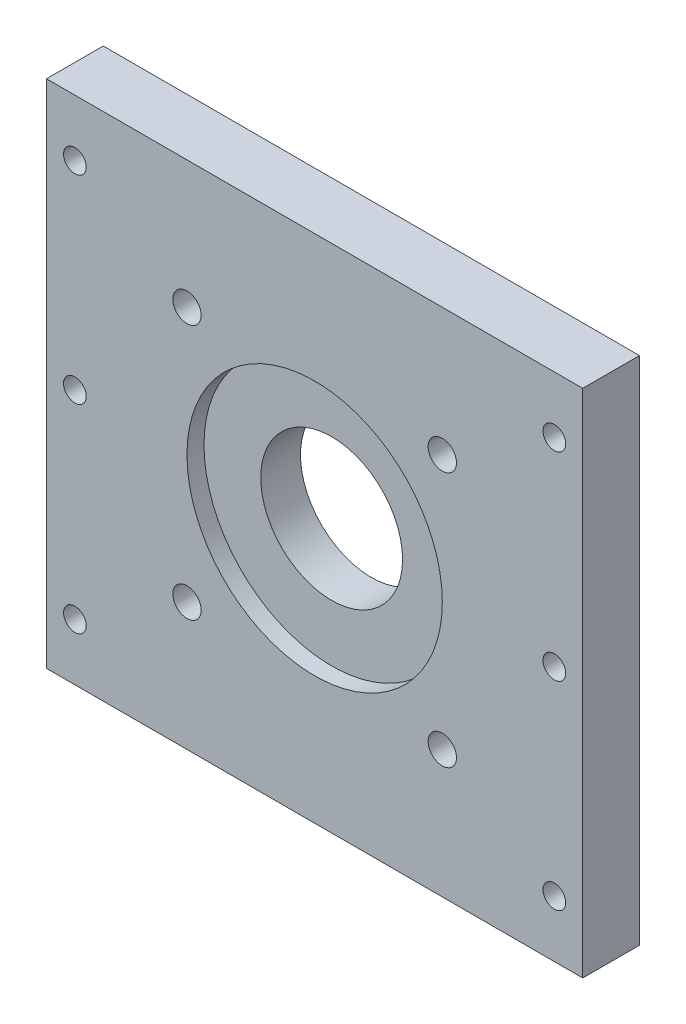
ISO-10303-21;
HEADER;
FILE_DESCRIPTION(('STEP AP214'),'2;1');
FILE_NAME('part.step','',(''),(''),'','','');
FILE_SCHEMA(('AUTOMOTIVE_DESIGN { 1 0 10303 214 1 1 1 1 }'));
ENDSEC;
DATA;
#1=APPLICATION_CONTEXT('core data for automotive mechanical design processes');
#2=APPLICATION_PROTOCOL_DEFINITION('international standard','automotive_design',2000,#1);
#3=PRODUCT_CONTEXT('',#1,'mechanical');
#4=PRODUCT('Part','Part','',(#3));
#5=PRODUCT_RELATED_PRODUCT_CATEGORY('part','',(#4));
#6=PRODUCT_DEFINITION_FORMATION('','',#4);
#7=PRODUCT_DEFINITION_CONTEXT('part definition',#1,'design');
#8=PRODUCT_DEFINITION('design','',#6,#7);
#9=PRODUCT_DEFINITION_SHAPE('','',#8);
#10=(LENGTH_UNIT() NAMED_UNIT(*) SI_UNIT(.MILLI.,.METRE.));
#11=(NAMED_UNIT(*) PLANE_ANGLE_UNIT() SI_UNIT($,.RADIAN.));
#12=(NAMED_UNIT(*) SI_UNIT($,.STERADIAN.) SOLID_ANGLE_UNIT());
#13=UNCERTAINTY_MEASURE_WITH_UNIT(LENGTH_MEASURE(1.E-05),#10,'distance_accuracy_value','');
#14=(GEOMETRIC_REPRESENTATION_CONTEXT(3) GLOBAL_UNCERTAINTY_ASSIGNED_CONTEXT((#13)) GLOBAL_UNIT_ASSIGNED_CONTEXT((#10,
#11,#12)) REPRESENTATION_CONTEXT('',''));
#15=CARTESIAN_POINT('',(0.,0.,0.));
#16=DIRECTION('',(0.,0.,1.));
#17=DIRECTION('',(1.,0.,0.));
#18=AXIS2_PLACEMENT_3D('',#15,#16,#17);
#19=CARTESIAN_POINT('',(47.25,45.,10.));
#20=DIRECTION('',(0.,0.,-1.));
#21=DIRECTION('',(-1.,0.,0.));
#22=AXIS2_PLACEMENT_3D('',#19,#20,#21);
#23=CYLINDRICAL_SURFACE('',#22,12.5);
#24=CARTESIAN_POINT('',(47.25,45.,0.));
#25=DIRECTION('',(0.,0.,1.));
#26=DIRECTION('',(1.,0.,0.));
#27=AXIS2_PLACEMENT_3D('',#24,#25,#26);
#28=CIRCLE('',#27,12.5);
#29=CARTESIAN_POINT('',(59.75,45.,0.));
#30=VERTEX_POINT('',#29);
#31=EDGE_CURVE('E176',#30,#30,#28,.T.);
#32=ORIENTED_EDGE('',*,*,#31,.F.);
#33=EDGE_LOOP('',(#32));
#34=FACE_BOUND('',#33,.T.);
#35=CARTESIAN_POINT('',(47.25,45.,7.));
#36=DIRECTION('',(0.,0.,1.));
#37=DIRECTION('',(1.,0.,0.));
#38=AXIS2_PLACEMENT_3D('',#35,#36,#37);
#39=CIRCLE('',#38,12.5);
#40=CARTESIAN_POINT('',(59.75,45.,7.));
#41=VERTEX_POINT('',#40);
#42=EDGE_CURVE('E41',#41,#41,#39,.T.);
#43=ORIENTED_EDGE('',*,*,#42,.T.);
#44=EDGE_LOOP('',(#43));
#45=FACE_BOUND('',#44,.T.);
#46=ADVANCED_FACE('F37',(#34,#45),#23,.F.);
#47=CARTESIAN_POINT('',(0.,0.,10.));
#48=DIRECTION('',(0.,0.,-1.));
#49=DIRECTION('',(-1.,0.,0.));
#50=AXIS2_PLACEMENT_3D('',#47,#48,#49);
#51=PLANE('',#50);
#52=CARTESIAN_POINT('',(47.25,45.,10.));
#53=DIRECTION('',(0.,0.,1.));
#54=DIRECTION('',(1.,0.,0.));
#55=AXIS2_PLACEMENT_3D('',#52,#53,#54);
#56=CIRCLE('',#55,22.5);
#57=CARTESIAN_POINT('',(69.75,45.,10.));
#58=VERTEX_POINT('',#57);
#59=EDGE_CURVE('E181',#58,#58,#56,.T.);
#60=ORIENTED_EDGE('',*,*,#59,.F.);
#61=EDGE_LOOP('',(#60));
#62=FACE_BOUND('',#61,.T.);
#63=DIRECTION('',(0.,-1.,0.));
#64=VECTOR('',#63,1.);
#65=CARTESIAN_POINT('',(0.,0.,10.));
#66=LINE('',#65,#64);
#67=CARTESIAN_POINT('',(0.,90.,10.));
#68=VERTEX_POINT('',#67);
#69=CARTESIAN_POINT('',(0.,0.,10.));
#70=VERTEX_POINT('',#69);
#71=EDGE_CURVE('E91',#68,#70,#66,.T.);
#72=ORIENTED_EDGE('',*,*,#71,.T.);
#73=DIRECTION('',(1.,0.,0.));
#74=VECTOR('',#73,1.);
#75=CARTESIAN_POINT('',(0.,0.,10.));
#76=LINE('',#75,#74);
#77=CARTESIAN_POINT('',(94.5,0.,10.));
#78=VERTEX_POINT('',#77);
#79=EDGE_CURVE('E85',#70,#78,#76,.T.);
#80=ORIENTED_EDGE('',*,*,#79,.T.);
#81=DIRECTION('',(0.,1.,0.));
#82=VECTOR('',#81,1.);
#83=CARTESIAN_POINT('',(94.5,0.,10.));
#84=LINE('',#83,#82);
#85=CARTESIAN_POINT('',(94.5,90.,10.));
#86=VERTEX_POINT('',#85);
#87=EDGE_CURVE('E89',#78,#86,#84,.T.);
#88=ORIENTED_EDGE('',*,*,#87,.T.);
#89=DIRECTION('',(-1.,0.,0.));
#90=VECTOR('',#89,1.);
#91=CARTESIAN_POINT('',(0.,90.,10.));
#92=LINE('',#91,#90);
#93=EDGE_CURVE('E55',#86,#68,#92,.T.);
#94=ORIENTED_EDGE('',*,*,#93,.T.);
#95=EDGE_LOOP('',(#72,#80,#88,#94));
#96=FACE_BOUND('',#95,.T.);
#97=CARTESIAN_POINT('',(5.00000000000001,80.,10.));
#98=DIRECTION('',(0.,0.,1.));
#99=DIRECTION('',(1.,0.,0.));
#100=AXIS2_PLACEMENT_3D('',#97,#98,#99);
#101=CIRCLE('',#100,2.);
#102=CARTESIAN_POINT('',(7.00000000000001,80.,10.));
#103=VERTEX_POINT('',#102);
#104=EDGE_CURVE('E107',#103,#103,#101,.T.);
#105=ORIENTED_EDGE('',*,*,#104,.F.);
#106=EDGE_LOOP('',(#105));
#107=FACE_BOUND('',#106,.T.);
#108=CARTESIAN_POINT('',(5.00000000000001,45.,10.));
#109=DIRECTION('',(0.,0.,1.));
#110=DIRECTION('',(1.,0.,0.));
#111=AXIS2_PLACEMENT_3D('',#108,#109,#110);
#112=CIRCLE('',#111,2.);
#113=CARTESIAN_POINT('',(7.00000000000001,45.,10.));
#114=VERTEX_POINT('',#113);
#115=EDGE_CURVE('E122',#114,#114,#112,.T.);
#116=ORIENTED_EDGE('',*,*,#115,.F.);
#117=EDGE_LOOP('',(#116));
#118=FACE_BOUND('',#117,.T.);
#119=CARTESIAN_POINT('',(5.00000000000001,10.,10.));
#120=DIRECTION('',(0.,0.,1.));
#121=DIRECTION('',(-1.,0.,0.));
#122=AXIS2_PLACEMENT_3D('',#119,#120,#121);
#123=CIRCLE('',#122,2.);
#124=CARTESIAN_POINT('',(3.00000000000001,10.,10.));
#125=VERTEX_POINT('',#124);
#126=EDGE_CURVE('E128',#125,#125,#123,.T.);
#127=ORIENTED_EDGE('',*,*,#126,.F.);
#128=EDGE_LOOP('',(#127));
#129=FACE_BOUND('',#128,.T.);
#130=CARTESIAN_POINT('',(89.5,10.,10.));
#131=DIRECTION('',(0.,0.,1.));
#132=DIRECTION('',(1.,0.,0.));
#133=AXIS2_PLACEMENT_3D('',#130,#131,#132);
#134=CIRCLE('',#133,2.);
#135=CARTESIAN_POINT('',(91.5,10.,10.));
#136=VERTEX_POINT('',#135);
#137=EDGE_CURVE('E134',#136,#136,#134,.T.);
#138=ORIENTED_EDGE('',*,*,#137,.F.);
#139=EDGE_LOOP('',(#138));
#140=FACE_BOUND('',#139,.T.);
#141=CARTESIAN_POINT('',(89.5,45.,10.));
#142=DIRECTION('',(0.,0.,1.));
#143=DIRECTION('',(-1.,0.,0.));
#144=AXIS2_PLACEMENT_3D('',#141,#142,#143);
#145=CIRCLE('',#144,2.00000000000001);
#146=CARTESIAN_POINT('',(87.5,45.,10.));
#147=VERTEX_POINT('',#146);
#148=EDGE_CURVE('E140',#147,#147,#145,.T.);
#149=ORIENTED_EDGE('',*,*,#148,.F.);
#150=EDGE_LOOP('',(#149));
#151=FACE_BOUND('',#150,.T.);
#152=CARTESIAN_POINT('',(89.5,80.,10.));
#153=DIRECTION('',(0.,0.,1.));
#154=DIRECTION('',(-1.,0.,0.));
#155=AXIS2_PLACEMENT_3D('',#152,#153,#154);
#156=CIRCLE('',#155,2.);
#157=CARTESIAN_POINT('',(87.5,80.,10.));
#158=VERTEX_POINT('',#157);
#159=EDGE_CURVE('E146',#158,#158,#156,.T.);
#160=ORIENTED_EDGE('',*,*,#159,.F.);
#161=EDGE_LOOP('',(#160));
#162=FACE_BOUND('',#161,.T.);
#163=CARTESIAN_POINT('',(24.75,67.5,10.));
#164=DIRECTION('',(0.,0.,1.));
#165=DIRECTION('',(1.,0.,0.));
#166=AXIS2_PLACEMENT_3D('',#163,#164,#165);
#167=CIRCLE('',#166,2.5);
#168=CARTESIAN_POINT('',(27.25,67.5,10.));
#169=VERTEX_POINT('',#168);
#170=EDGE_CURVE('E152',#169,#169,#167,.T.);
#171=ORIENTED_EDGE('',*,*,#170,.F.);
#172=EDGE_LOOP('',(#171));
#173=FACE_BOUND('',#172,.T.);
#174=CARTESIAN_POINT('',(69.75,67.5,10.));
#175=DIRECTION('',(0.,0.,1.));
#176=DIRECTION('',(1.,0.,0.));
#177=AXIS2_PLACEMENT_3D('',#174,#175,#176);
#178=CIRCLE('',#177,2.50000000000001);
#179=CARTESIAN_POINT('',(72.25,67.5,10.));
#180=VERTEX_POINT('',#179);
#181=EDGE_CURVE('E158',#180,#180,#178,.T.);
#182=ORIENTED_EDGE('',*,*,#181,.F.);
#183=EDGE_LOOP('',(#182));
#184=FACE_BOUND('',#183,.T.);
#185=CARTESIAN_POINT('',(69.75,22.5,10.));
#186=DIRECTION('',(0.,0.,1.));
#187=DIRECTION('',(1.,0.,0.));
#188=AXIS2_PLACEMENT_3D('',#185,#186,#187);
#189=CIRCLE('',#188,2.50000000000001);
#190=CARTESIAN_POINT('',(72.25,22.5,10.));
#191=VERTEX_POINT('',#190);
#192=EDGE_CURVE('E164',#191,#191,#189,.T.);
#193=ORIENTED_EDGE('',*,*,#192,.F.);
#194=EDGE_LOOP('',(#193));
#195=FACE_BOUND('',#194,.T.);
#196=CARTESIAN_POINT('',(24.75,22.5,10.));
#197=DIRECTION('',(0.,0.,1.));
#198=DIRECTION('',(1.,0.,0.));
#199=AXIS2_PLACEMENT_3D('',#196,#197,#198);
#200=CIRCLE('',#199,2.5);
#201=CARTESIAN_POINT('',(27.25,22.5,10.));
#202=VERTEX_POINT('',#201);
#203=EDGE_CURVE('E170',#202,#202,#200,.T.);
#204=ORIENTED_EDGE('',*,*,#203,.F.);
#205=EDGE_LOOP('',(#204));
#206=FACE_BOUND('',#205,.T.);
#207=ADVANCED_FACE('F86',(#62,#96,#107,#118,#129,#140,#151,#162,#173,#184,#195,#206),#51,.F.);
#208=CARTESIAN_POINT('',(0.,0.,0.));
#209=DIRECTION('',(0.,0.,-1.));
#210=DIRECTION('',(-1.,0.,0.));
#211=AXIS2_PLACEMENT_3D('',#208,#209,#210);
#212=PLANE('',#211);
#213=CARTESIAN_POINT('',(24.75,22.5,0.));
#214=DIRECTION('',(0.,0.,1.));
#215=DIRECTION('',(1.,0.,0.));
#216=AXIS2_PLACEMENT_3D('',#213,#214,#215);
#217=CIRCLE('',#216,2.5);
#218=CARTESIAN_POINT('',(27.25,22.5,0.));
#219=VERTEX_POINT('',#218);
#220=EDGE_CURVE('E173',#219,#219,#217,.T.);
#221=ORIENTED_EDGE('',*,*,#220,.T.);
#222=EDGE_LOOP('',(#221));
#223=FACE_BOUND('',#222,.T.);
#224=CARTESIAN_POINT('',(69.75,67.5,0.));
#225=DIRECTION('',(0.,0.,1.));
#226=DIRECTION('',(1.,0.,0.));
#227=AXIS2_PLACEMENT_3D('',#224,#225,#226);
#228=CIRCLE('',#227,2.50000000000001);
#229=CARTESIAN_POINT('',(72.25,67.5,0.));
#230=VERTEX_POINT('',#229);
#231=EDGE_CURVE('E161',#230,#230,#228,.T.);
#232=ORIENTED_EDGE('',*,*,#231,.T.);
#233=EDGE_LOOP('',(#232));
#234=FACE_BOUND('',#233,.T.);
#235=CARTESIAN_POINT('',(89.5,80.,0.));
#236=DIRECTION('',(0.,0.,1.));
#237=DIRECTION('',(-1.,0.,0.));
#238=AXIS2_PLACEMENT_3D('',#235,#236,#237);
#239=CIRCLE('',#238,2.);
#240=CARTESIAN_POINT('',(87.5,80.,0.));
#241=VERTEX_POINT('',#240);
#242=EDGE_CURVE('E149',#241,#241,#239,.T.);
#243=ORIENTED_EDGE('',*,*,#242,.T.);
#244=EDGE_LOOP('',(#243));
#245=FACE_BOUND('',#244,.T.);
#246=CARTESIAN_POINT('',(89.5,10.,0.));
#247=DIRECTION('',(0.,0.,1.));
#248=DIRECTION('',(1.,0.,0.));
#249=AXIS2_PLACEMENT_3D('',#246,#247,#248);
#250=CIRCLE('',#249,2.);
#251=CARTESIAN_POINT('',(91.5,10.,0.));
#252=VERTEX_POINT('',#251);
#253=EDGE_CURVE('E137',#252,#252,#250,.T.);
#254=ORIENTED_EDGE('',*,*,#253,.T.);
#255=EDGE_LOOP('',(#254));
#256=FACE_BOUND('',#255,.T.);
#257=CARTESIAN_POINT('',(5.00000000000001,45.,0.));
#258=DIRECTION('',(0.,0.,1.));
#259=DIRECTION('',(1.,0.,0.));
#260=AXIS2_PLACEMENT_3D('',#257,#258,#259);
#261=CIRCLE('',#260,2.);
#262=CARTESIAN_POINT('',(7.00000000000001,45.,0.));
#263=VERTEX_POINT('',#262);
#264=EDGE_CURVE('E125',#263,#263,#261,.T.);
#265=ORIENTED_EDGE('',*,*,#264,.T.);
#266=EDGE_LOOP('',(#265));
#267=FACE_BOUND('',#266,.T.);
#268=DIRECTION('',(0.,-1.,0.));
#269=VECTOR('',#268,1.);
#270=CARTESIAN_POINT('',(0.,0.,0.));
#271=LINE('',#270,#269);
#272=CARTESIAN_POINT('',(0.,90.,0.));
#273=VERTEX_POINT('',#272);
#274=CARTESIAN_POINT('',(0.,0.,0.));
#275=VERTEX_POINT('',#274);
#276=EDGE_CURVE('E104',#273,#275,#271,.T.);
#277=ORIENTED_EDGE('',*,*,#276,.F.);
#278=DIRECTION('',(-1.,0.,0.));
#279=VECTOR('',#278,1.);
#280=CARTESIAN_POINT('',(0.,90.,0.));
#281=LINE('',#280,#279);
#282=CARTESIAN_POINT('',(94.5,90.,0.));
#283=VERTEX_POINT('',#282);
#284=EDGE_CURVE('E78',#283,#273,#281,.T.);
#285=ORIENTED_EDGE('',*,*,#284,.F.);
#286=DIRECTION('',(0.,1.,0.));
#287=VECTOR('',#286,1.);
#288=CARTESIAN_POINT('',(94.5,0.,0.));
#289=LINE('',#288,#287);
#290=CARTESIAN_POINT('',(94.5,0.,0.));
#291=VERTEX_POINT('',#290);
#292=EDGE_CURVE('E72',#291,#283,#289,.T.);
#293=ORIENTED_EDGE('',*,*,#292,.F.);
#294=DIRECTION('',(1.,0.,0.));
#295=VECTOR('',#294,1.);
#296=CARTESIAN_POINT('',(0.,0.,0.));
#297=LINE('',#296,#295);
#298=EDGE_CURVE('E95',#275,#291,#297,.T.);
#299=ORIENTED_EDGE('',*,*,#298,.F.);
#300=EDGE_LOOP('',(#277,#285,#293,#299));
#301=FACE_BOUND('',#300,.T.);
#302=CARTESIAN_POINT('',(5.00000000000001,80.,0.));
#303=DIRECTION('',(0.,0.,1.));
#304=DIRECTION('',(1.,0.,0.));
#305=AXIS2_PLACEMENT_3D('',#302,#303,#304);
#306=CIRCLE('',#305,2.);
#307=CARTESIAN_POINT('',(7.00000000000001,80.,0.));
#308=VERTEX_POINT('',#307);
#309=EDGE_CURVE('E119',#308,#308,#306,.T.);
#310=ORIENTED_EDGE('',*,*,#309,.T.);
#311=EDGE_LOOP('',(#310));
#312=FACE_BOUND('',#311,.T.);
#313=CARTESIAN_POINT('',(5.00000000000001,10.,0.));
#314=DIRECTION('',(0.,0.,1.));
#315=DIRECTION('',(-1.,0.,0.));
#316=AXIS2_PLACEMENT_3D('',#313,#314,#315);
#317=CIRCLE('',#316,2.);
#318=CARTESIAN_POINT('',(3.00000000000001,10.,0.));
#319=VERTEX_POINT('',#318);
#320=EDGE_CURVE('E131',#319,#319,#317,.T.);
#321=ORIENTED_EDGE('',*,*,#320,.T.);
#322=EDGE_LOOP('',(#321));
#323=FACE_BOUND('',#322,.T.);
#324=CARTESIAN_POINT('',(89.5,45.,0.));
#325=DIRECTION('',(0.,0.,1.));
#326=DIRECTION('',(-1.,0.,0.));
#327=AXIS2_PLACEMENT_3D('',#324,#325,#326);
#328=CIRCLE('',#327,2.00000000000001);
#329=CARTESIAN_POINT('',(87.5,45.,0.));
#330=VERTEX_POINT('',#329);
#331=EDGE_CURVE('E143',#330,#330,#328,.T.);
#332=ORIENTED_EDGE('',*,*,#331,.T.);
#333=EDGE_LOOP('',(#332));
#334=FACE_BOUND('',#333,.T.);
#335=CARTESIAN_POINT('',(24.75,67.5,0.));
#336=DIRECTION('',(0.,0.,1.));
#337=DIRECTION('',(1.,0.,0.));
#338=AXIS2_PLACEMENT_3D('',#335,#336,#337);
#339=CIRCLE('',#338,2.5);
#340=CARTESIAN_POINT('',(27.25,67.5,0.));
#341=VERTEX_POINT('',#340);
#342=EDGE_CURVE('E155',#341,#341,#339,.T.);
#343=ORIENTED_EDGE('',*,*,#342,.T.);
#344=EDGE_LOOP('',(#343));
#345=FACE_BOUND('',#344,.T.);
#346=CARTESIAN_POINT('',(69.75,22.5,0.));
#347=DIRECTION('',(0.,0.,1.));
#348=DIRECTION('',(1.,0.,0.));
#349=AXIS2_PLACEMENT_3D('',#346,#347,#348);
#350=CIRCLE('',#349,2.50000000000001);
#351=CARTESIAN_POINT('',(72.25,22.5,0.));
#352=VERTEX_POINT('',#351);
#353=EDGE_CURVE('E167',#352,#352,#350,.T.);
#354=ORIENTED_EDGE('',*,*,#353,.T.);
#355=EDGE_LOOP('',(#354));
#356=FACE_BOUND('',#355,.T.);
#357=ORIENTED_EDGE('',*,*,#31,.T.);
#358=EDGE_LOOP('',(#357));
#359=FACE_BOUND('',#358,.T.);
#360=ADVANCED_FACE('F115',(#223,#234,#245,#256,#267,#301,#312,#323,#334,#345,#356,#359),#212,.T.);
#361=CARTESIAN_POINT('',(0.,0.,10.));
#362=DIRECTION('',(1.,0.,0.));
#363=DIRECTION('',(0.,0.,-1.));
#364=AXIS2_PLACEMENT_3D('',#361,#362,#363);
#365=PLANE('',#364);
#366=ORIENTED_EDGE('',*,*,#276,.T.);
#367=DIRECTION('',(0.,0.,-1.));
#368=VECTOR('',#367,1.);
#369=CARTESIAN_POINT('',(0.,0.,10.));
#370=LINE('',#369,#368);
#371=EDGE_CURVE('E11',#70,#275,#370,.T.);
#372=ORIENTED_EDGE('',*,*,#371,.F.);
#373=ORIENTED_EDGE('',*,*,#71,.F.);
#374=DIRECTION('',(0.,0.,-1.));
#375=VECTOR('',#374,1.);
#376=CARTESIAN_POINT('',(0.,90.,10.));
#377=LINE('',#376,#375);
#378=EDGE_CURVE('E100',#68,#273,#377,.T.);
#379=ORIENTED_EDGE('',*,*,#378,.T.);
#380=EDGE_LOOP('',(#366,#372,#373,#379));
#381=FACE_BOUND('',#380,.T.);
#382=ADVANCED_FACE('F39',(#381),#365,.F.);
#383=CARTESIAN_POINT('',(0.,0.,10.));
#384=DIRECTION('',(0.,1.,0.));
#385=DIRECTION('',(0.,0.,1.));
#386=AXIS2_PLACEMENT_3D('',#383,#384,#385);
#387=PLANE('',#386);
#388=ORIENTED_EDGE('',*,*,#298,.T.);
#389=DIRECTION('',(0.,0.,-1.));
#390=VECTOR('',#389,1.);
#391=CARTESIAN_POINT('',(94.5,0.,10.));
#392=LINE('',#391,#390);
#393=EDGE_CURVE('E47',#78,#291,#392,.T.);
#394=ORIENTED_EDGE('',*,*,#393,.F.);
#395=ORIENTED_EDGE('',*,*,#79,.F.);
#396=ORIENTED_EDGE('',*,*,#371,.T.);
#397=EDGE_LOOP('',(#388,#394,#395,#396));
#398=FACE_BOUND('',#397,.T.);
#399=ADVANCED_FACE('F94',(#398),#387,.F.);
#400=CARTESIAN_POINT('',(94.5,0.,10.));
#401=DIRECTION('',(-1.,0.,0.));
#402=DIRECTION('',(0.,0.,1.));
#403=AXIS2_PLACEMENT_3D('',#400,#401,#402);
#404=PLANE('',#403);
#405=ORIENTED_EDGE('',*,*,#292,.T.);
#406=DIRECTION('',(0.,0.,-1.));
#407=VECTOR('',#406,1.);
#408=CARTESIAN_POINT('',(94.5,90.,10.));
#409=LINE('',#408,#407);
#410=EDGE_CURVE('E96',#86,#283,#409,.T.);
#411=ORIENTED_EDGE('',*,*,#410,.F.);
#412=ORIENTED_EDGE('',*,*,#87,.F.);
#413=ORIENTED_EDGE('',*,*,#393,.T.);
#414=EDGE_LOOP('',(#405,#411,#412,#413));
#415=FACE_BOUND('',#414,.T.);
#416=ADVANCED_FACE('F98',(#415),#404,.F.);
#417=CARTESIAN_POINT('',(0.,90.,10.));
#418=DIRECTION('',(0.,-1.,0.));
#419=DIRECTION('',(1.,0.,0.));
#420=AXIS2_PLACEMENT_3D('',#417,#418,#419);
#421=PLANE('',#420);
#422=ORIENTED_EDGE('',*,*,#284,.T.);
#423=ORIENTED_EDGE('',*,*,#378,.F.);
#424=ORIENTED_EDGE('',*,*,#93,.F.);
#425=ORIENTED_EDGE('',*,*,#410,.T.);
#426=EDGE_LOOP('',(#422,#423,#424,#425));
#427=FACE_BOUND('',#426,.T.);
#428=ADVANCED_FACE('F112',(#427),#421,.F.);
#429=CARTESIAN_POINT('',(5.00000000000001,80.,10.));
#430=DIRECTION('',(0.,0.,-1.));
#431=DIRECTION('',(-1.,0.,0.));
#432=AXIS2_PLACEMENT_3D('',#429,#430,#431);
#433=CYLINDRICAL_SURFACE('',#432,2.);
#434=ORIENTED_EDGE('',*,*,#104,.T.);
#435=EDGE_LOOP('',(#434));
#436=FACE_BOUND('',#435,.T.);
#437=ORIENTED_EDGE('',*,*,#309,.F.);
#438=EDGE_LOOP('',(#437));
#439=FACE_BOUND('',#438,.T.);
#440=ADVANCED_FACE('F247',(#436,#439),#433,.F.);
#441=CARTESIAN_POINT('',(5.00000000000001,45.,10.));
#442=DIRECTION('',(0.,0.,-1.));
#443=DIRECTION('',(-1.,0.,0.));
#444=AXIS2_PLACEMENT_3D('',#441,#442,#443);
#445=CYLINDRICAL_SURFACE('',#444,2.);
#446=ORIENTED_EDGE('',*,*,#115,.T.);
#447=EDGE_LOOP('',(#446));
#448=FACE_BOUND('',#447,.T.);
#449=ORIENTED_EDGE('',*,*,#264,.F.);
#450=EDGE_LOOP('',(#449));
#451=FACE_BOUND('',#450,.T.);
#452=ADVANCED_FACE('F243',(#448,#451),#445,.F.);
#453=CARTESIAN_POINT('',(5.00000000000001,10.,10.));
#454=DIRECTION('',(0.,0.,-1.));
#455=DIRECTION('',(-1.,0.,0.));
#456=AXIS2_PLACEMENT_3D('',#453,#454,#455);
#457=CYLINDRICAL_SURFACE('',#456,2.);
#458=ORIENTED_EDGE('',*,*,#126,.T.);
#459=EDGE_LOOP('',(#458));
#460=FACE_BOUND('',#459,.T.);
#461=ORIENTED_EDGE('',*,*,#320,.F.);
#462=EDGE_LOOP('',(#461));
#463=FACE_BOUND('',#462,.T.);
#464=ADVANCED_FACE('F239',(#460,#463),#457,.F.);
#465=CARTESIAN_POINT('',(89.5,10.,10.));
#466=DIRECTION('',(0.,0.,-1.));
#467=DIRECTION('',(-1.,0.,0.));
#468=AXIS2_PLACEMENT_3D('',#465,#466,#467);
#469=CYLINDRICAL_SURFACE('',#468,2.);
#470=ORIENTED_EDGE('',*,*,#137,.T.);
#471=EDGE_LOOP('',(#470));
#472=FACE_BOUND('',#471,.T.);
#473=ORIENTED_EDGE('',*,*,#253,.F.);
#474=EDGE_LOOP('',(#473));
#475=FACE_BOUND('',#474,.T.);
#476=ADVANCED_FACE('F235',(#472,#475),#469,.F.);
#477=CARTESIAN_POINT('',(89.5,45.,10.));
#478=DIRECTION('',(0.,0.,-1.));
#479=DIRECTION('',(-1.,0.,0.));
#480=AXIS2_PLACEMENT_3D('',#477,#478,#479);
#481=CYLINDRICAL_SURFACE('',#480,2.00000000000001);
#482=ORIENTED_EDGE('',*,*,#148,.T.);
#483=EDGE_LOOP('',(#482));
#484=FACE_BOUND('',#483,.T.);
#485=ORIENTED_EDGE('',*,*,#331,.F.);
#486=EDGE_LOOP('',(#485));
#487=FACE_BOUND('',#486,.T.);
#488=ADVANCED_FACE('F231',(#484,#487),#481,.F.);
#489=CARTESIAN_POINT('',(89.5,80.,10.));
#490=DIRECTION('',(0.,0.,-1.));
#491=DIRECTION('',(-1.,0.,0.));
#492=AXIS2_PLACEMENT_3D('',#489,#490,#491);
#493=CYLINDRICAL_SURFACE('',#492,2.);
#494=ORIENTED_EDGE('',*,*,#159,.T.);
#495=EDGE_LOOP('',(#494));
#496=FACE_BOUND('',#495,.T.);
#497=ORIENTED_EDGE('',*,*,#242,.F.);
#498=EDGE_LOOP('',(#497));
#499=FACE_BOUND('',#498,.T.);
#500=ADVANCED_FACE('F227',(#496,#499),#493,.F.);
#501=CARTESIAN_POINT('',(24.75,67.5,10.));
#502=DIRECTION('',(0.,0.,-1.));
#503=DIRECTION('',(-1.,0.,0.));
#504=AXIS2_PLACEMENT_3D('',#501,#502,#503);
#505=CYLINDRICAL_SURFACE('',#504,2.5);
#506=ORIENTED_EDGE('',*,*,#170,.T.);
#507=EDGE_LOOP('',(#506));
#508=FACE_BOUND('',#507,.T.);
#509=ORIENTED_EDGE('',*,*,#342,.F.);
#510=EDGE_LOOP('',(#509));
#511=FACE_BOUND('',#510,.T.);
#512=ADVANCED_FACE('F223',(#508,#511),#505,.F.);
#513=CARTESIAN_POINT('',(69.75,67.5,10.));
#514=DIRECTION('',(0.,0.,-1.));
#515=DIRECTION('',(-1.,0.,0.));
#516=AXIS2_PLACEMENT_3D('',#513,#514,#515);
#517=CYLINDRICAL_SURFACE('',#516,2.50000000000001);
#518=ORIENTED_EDGE('',*,*,#181,.T.);
#519=EDGE_LOOP('',(#518));
#520=FACE_BOUND('',#519,.T.);
#521=ORIENTED_EDGE('',*,*,#231,.F.);
#522=EDGE_LOOP('',(#521));
#523=FACE_BOUND('',#522,.T.);
#524=ADVANCED_FACE('F219',(#520,#523),#517,.F.);
#525=CARTESIAN_POINT('',(69.75,22.5,10.));
#526=DIRECTION('',(0.,0.,-1.));
#527=DIRECTION('',(-1.,0.,0.));
#528=AXIS2_PLACEMENT_3D('',#525,#526,#527);
#529=CYLINDRICAL_SURFACE('',#528,2.50000000000001);
#530=ORIENTED_EDGE('',*,*,#192,.T.);
#531=EDGE_LOOP('',(#530));
#532=FACE_BOUND('',#531,.T.);
#533=ORIENTED_EDGE('',*,*,#353,.F.);
#534=EDGE_LOOP('',(#533));
#535=FACE_BOUND('',#534,.T.);
#536=ADVANCED_FACE('F215',(#532,#535),#529,.F.);
#537=CARTESIAN_POINT('',(24.75,22.5,10.));
#538=DIRECTION('',(0.,0.,-1.));
#539=DIRECTION('',(-1.,0.,0.));
#540=AXIS2_PLACEMENT_3D('',#537,#538,#539);
#541=CYLINDRICAL_SURFACE('',#540,2.5);
#542=ORIENTED_EDGE('',*,*,#203,.T.);
#543=EDGE_LOOP('',(#542));
#544=FACE_BOUND('',#543,.T.);
#545=ORIENTED_EDGE('',*,*,#220,.F.);
#546=EDGE_LOOP('',(#545));
#547=FACE_BOUND('',#546,.T.);
#548=ADVANCED_FACE('F199',(#544,#547),#541,.F.);
#549=CARTESIAN_POINT('',(47.25,45.,7.));
#550=DIRECTION('',(0.,0.,1.));
#551=DIRECTION('',(1.,0.,0.));
#552=AXIS2_PLACEMENT_3D('',#549,#550,#551);
#553=CYLINDRICAL_SURFACE('',#552,22.5);
#554=CARTESIAN_POINT('',(47.25,45.,7.));
#555=DIRECTION('',(0.,0.,1.));
#556=DIRECTION('',(1.,0.,0.));
#557=AXIS2_PLACEMENT_3D('',#554,#555,#556);
#558=CIRCLE('',#557,22.5);
#559=CARTESIAN_POINT('',(69.75,45.,7.));
#560=VERTEX_POINT('',#559);
#561=EDGE_CURVE('E184',#560,#560,#558,.T.);
#562=ORIENTED_EDGE('',*,*,#561,.F.);
#563=EDGE_LOOP('',(#562));
#564=FACE_BOUND('',#563,.T.);
#565=ORIENTED_EDGE('',*,*,#59,.T.);
#566=EDGE_LOOP('',(#565));
#567=FACE_BOUND('',#566,.T.);
#568=ADVANCED_FACE('F194',(#564,#567),#553,.F.);
#569=CARTESIAN_POINT('',(47.25,45.,7.));
#570=DIRECTION('',(0.,0.,1.));
#571=DIRECTION('',(1.,0.,0.));
#572=AXIS2_PLACEMENT_3D('',#569,#570,#571);
#573=PLANE('',#572);
#574=ORIENTED_EDGE('',*,*,#42,.F.);
#575=EDGE_LOOP('',(#574));
#576=FACE_BOUND('',#575,.T.);
#577=ORIENTED_EDGE('',*,*,#561,.T.);
#578=EDGE_LOOP('',(#577));
#579=FACE_BOUND('',#578,.T.);
#580=ADVANCED_FACE('F192',(#576,#579),#573,.T.);
#581=CLOSED_SHELL('',(#46,#207,#360,#382,#399,#416,#428,#440,#452,#464,#476,#488,#500,#512,#524,
#536,#548,#568,#580));
#582=MANIFOLD_SOLID_BREP('B2',#581);
#583=ADVANCED_BREP_SHAPE_REPRESENTATION('',(#18,#582),#14);
#584=SHAPE_DEFINITION_REPRESENTATION(#9,#583);
ENDSEC;
END-ISO-10303-21;
